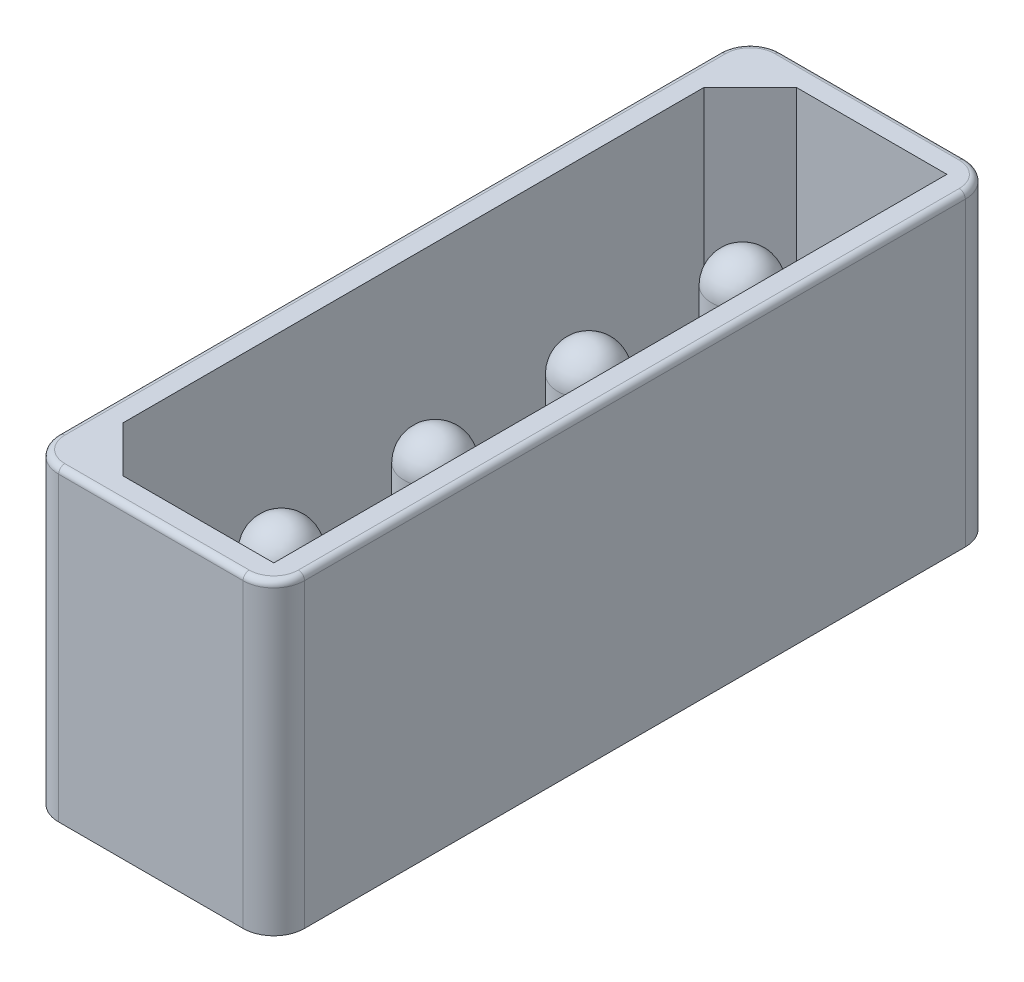
ISO-10303-21;
HEADER;
FILE_DESCRIPTION(('STEP AP214'),'2;1');
FILE_NAME('part.step','',(''),(''),'','','');
FILE_SCHEMA(('AUTOMOTIVE_DESIGN { 1 0 10303 214 1 1 1 1 }'));
ENDSEC;
DATA;
#1=APPLICATION_CONTEXT('core data for automotive mechanical design processes');
#2=APPLICATION_PROTOCOL_DEFINITION('international standard','automotive_design',2000,#1);
#3=PRODUCT_CONTEXT('',#1,'mechanical');
#4=PRODUCT('Part','Part','',(#3));
#5=PRODUCT_RELATED_PRODUCT_CATEGORY('part','',(#4));
#6=PRODUCT_DEFINITION_FORMATION('','',#4);
#7=PRODUCT_DEFINITION_CONTEXT('part definition',#1,'design');
#8=PRODUCT_DEFINITION('design','',#6,#7);
#9=PRODUCT_DEFINITION_SHAPE('','',#8);
#10=(LENGTH_UNIT() NAMED_UNIT(*) SI_UNIT(.MILLI.,.METRE.));
#11=(NAMED_UNIT(*) PLANE_ANGLE_UNIT() SI_UNIT($,.RADIAN.));
#12=(NAMED_UNIT(*) SI_UNIT($,.STERADIAN.) SOLID_ANGLE_UNIT());
#13=UNCERTAINTY_MEASURE_WITH_UNIT(LENGTH_MEASURE(1.E-05),#10,'distance_accuracy_value','');
#14=(GEOMETRIC_REPRESENTATION_CONTEXT(3) GLOBAL_UNCERTAINTY_ASSIGNED_CONTEXT((#13)) GLOBAL_UNIT_ASSIGNED_CONTEXT((#10,
#11,#12)) REPRESENTATION_CONTEXT('',''));
#15=CARTESIAN_POINT('',(0.,0.,0.));
#16=DIRECTION('',(0.,0.,1.));
#17=DIRECTION('',(1.,0.,0.));
#18=AXIS2_PLACEMENT_3D('',#15,#16,#17);
#19=CARTESIAN_POINT('',(-3.,1.5,10.75));
#20=DIRECTION('',(0.,-1.,0.));
#21=DIRECTION('',(0.,0.,-1.));
#22=AXIS2_PLACEMENT_3D('',#19,#20,#21);
#23=CYLINDRICAL_SURFACE('',#22,1.);
#24=CARTESIAN_POINT('',(-3.,1.,10.75));
#25=DIRECTION('',(0.,-1.,0.));
#26=DIRECTION('',(0.,0.,-1.));
#27=AXIS2_PLACEMENT_3D('',#24,#25,#26);
#28=CIRCLE('',#27,1.);
#29=CARTESIAN_POINT('',(-3.,1.,11.75));
#30=VERTEX_POINT('',#29);
#31=CARTESIAN_POINT('',(-4.,1.,10.75));
#32=VERTEX_POINT('',#31);
#33=EDGE_CURVE('E289',#30,#32,#28,.T.);
#34=ORIENTED_EDGE('',*,*,#33,.F.);
#35=DIRECTION('',(0.,-1.,0.));
#36=VECTOR('',#35,1.);
#37=CARTESIAN_POINT('',(-3.,1.5,11.75));
#38=LINE('',#37,#36);
#39=CARTESIAN_POINT('',(-3.,10.8,11.75));
#40=VERTEX_POINT('',#39);
#41=EDGE_CURVE('E12',#40,#30,#38,.T.);
#42=ORIENTED_EDGE('',*,*,#41,.F.);
#43=CARTESIAN_POINT('',(-3.,10.8,10.75));
#44=DIRECTION('',(0.,1.,0.));
#45=DIRECTION('',(0.,0.,1.));
#46=AXIS2_PLACEMENT_3D('',#43,#44,#45);
#47=CIRCLE('',#46,1.);
#48=CARTESIAN_POINT('',(-4.,10.8,10.75));
#49=VERTEX_POINT('',#48);
#50=EDGE_CURVE('E236',#40,#49,#47,.F.);
#51=ORIENTED_EDGE('',*,*,#50,.T.);
#52=DIRECTION('',(0.,-1.,0.));
#53=VECTOR('',#52,1.);
#54=CARTESIAN_POINT('',(-4.,1.5,10.75));
#55=LINE('',#54,#53);
#56=EDGE_CURVE('E51',#49,#32,#55,.T.);
#57=ORIENTED_EDGE('',*,*,#56,.T.);
#58=EDGE_LOOP('',(#34,#42,#51,#57));
#59=FACE_BOUND('',#58,.T.);
#60=ADVANCED_FACE('F48',(#59),#23,.T.);
#61=CARTESIAN_POINT('',(3.,1.5,11.75));
#62=DIRECTION('',(0.,0.,1.));
#63=DIRECTION('',(1.,0.,0.));
#64=AXIS2_PLACEMENT_3D('',#61,#62,#63);
#65=PLANE('',#64);
#66=DIRECTION('',(-1.,0.,0.));
#67=VECTOR('',#66,1.);
#68=CARTESIAN_POINT('',(3.,1.,11.75));
#69=LINE('',#68,#67);
#70=CARTESIAN_POINT('',(3.,1.,11.75));
#71=VERTEX_POINT('',#70);
#72=EDGE_CURVE('E310',#71,#30,#69,.T.);
#73=ORIENTED_EDGE('',*,*,#72,.F.);
#74=DIRECTION('',(0.,-1.,0.));
#75=VECTOR('',#74,1.);
#76=CARTESIAN_POINT('',(3.,1.5,11.75));
#77=LINE('',#76,#75);
#78=CARTESIAN_POINT('',(3.,10.8,11.75));
#79=VERTEX_POINT('',#78);
#80=EDGE_CURVE('E56',#79,#71,#77,.T.);
#81=ORIENTED_EDGE('',*,*,#80,.F.);
#82=DIRECTION('',(1.,0.,0.));
#83=VECTOR('',#82,1.);
#84=CARTESIAN_POINT('',(-3.,10.8,11.75));
#85=LINE('',#84,#83);
#86=EDGE_CURVE('E257',#79,#40,#85,.F.);
#87=ORIENTED_EDGE('',*,*,#86,.T.);
#88=ORIENTED_EDGE('',*,*,#41,.T.);
#89=EDGE_LOOP('',(#73,#81,#87,#88));
#90=FACE_BOUND('',#89,.T.);
#91=ADVANCED_FACE('F334',(#90),#65,.T.);
#92=CARTESIAN_POINT('',(3.,1.5,10.75));
#93=DIRECTION('',(0.,-1.,0.));
#94=DIRECTION('',(0.,0.,-1.));
#95=AXIS2_PLACEMENT_3D('',#92,#93,#94);
#96=CYLINDRICAL_SURFACE('',#95,1.);
#97=CARTESIAN_POINT('',(3.,1.,10.75));
#98=DIRECTION('',(0.,-1.,0.));
#99=DIRECTION('',(0.,0.,-1.));
#100=AXIS2_PLACEMENT_3D('',#97,#98,#99);
#101=CIRCLE('',#100,1.);
#102=CARTESIAN_POINT('',(4.,1.,10.75));
#103=VERTEX_POINT('',#102);
#104=EDGE_CURVE('E307',#103,#71,#101,.T.);
#105=ORIENTED_EDGE('',*,*,#104,.F.);
#106=DIRECTION('',(0.,-1.,0.));
#107=VECTOR('',#106,1.);
#108=CARTESIAN_POINT('',(4.,1.5,10.75));
#109=LINE('',#108,#107);
#110=CARTESIAN_POINT('',(4.,10.8,10.75));
#111=VERTEX_POINT('',#110);
#112=EDGE_CURVE('E314',#111,#103,#109,.T.);
#113=ORIENTED_EDGE('',*,*,#112,.F.);
#114=CARTESIAN_POINT('',(3.,10.8,10.75));
#115=DIRECTION('',(0.,1.,0.));
#116=DIRECTION('',(0.,0.,1.));
#117=AXIS2_PLACEMENT_3D('',#114,#115,#116);
#118=CIRCLE('',#117,1.);
#119=EDGE_CURVE('E254',#111,#79,#118,.F.);
#120=ORIENTED_EDGE('',*,*,#119,.T.);
#121=ORIENTED_EDGE('',*,*,#80,.T.);
#122=EDGE_LOOP('',(#105,#113,#120,#121));
#123=FACE_BOUND('',#122,.T.);
#124=ADVANCED_FACE('F381',(#123),#96,.T.);
#125=CARTESIAN_POINT('',(3.99999999999999,1.5,-10.75));
#126=DIRECTION('',(1.,0.,0.));
#127=DIRECTION('',(0.,0.,-1.));
#128=AXIS2_PLACEMENT_3D('',#125,#126,#127);
#129=PLANE('',#128);
#130=DIRECTION('',(0.,0.,1.));
#131=VECTOR('',#130,1.);
#132=CARTESIAN_POINT('',(3.99999999999999,1.,-10.75));
#133=LINE('',#132,#131);
#134=CARTESIAN_POINT('',(3.99999999999999,1.,-10.75));
#135=VERTEX_POINT('',#134);
#136=EDGE_CURVE('E304',#135,#103,#133,.T.);
#137=ORIENTED_EDGE('',*,*,#136,.F.);
#138=DIRECTION('',(0.,-1.,0.));
#139=VECTOR('',#138,1.);
#140=CARTESIAN_POINT('',(3.99999999999999,1.5,-10.75));
#141=LINE('',#140,#139);
#142=CARTESIAN_POINT('',(3.99999999999999,10.8,-10.75));
#143=VERTEX_POINT('',#142);
#144=EDGE_CURVE('E316',#143,#135,#141,.T.);
#145=ORIENTED_EDGE('',*,*,#144,.F.);
#146=DIRECTION('',(0.,0.,-1.));
#147=VECTOR('',#146,1.);
#148=CARTESIAN_POINT('',(4.,10.8,10.75));
#149=LINE('',#148,#147);
#150=EDGE_CURVE('E251',#143,#111,#149,.F.);
#151=ORIENTED_EDGE('',*,*,#150,.T.);
#152=ORIENTED_EDGE('',*,*,#112,.T.);
#153=EDGE_LOOP('',(#137,#145,#151,#152));
#154=FACE_BOUND('',#153,.T.);
#155=ADVANCED_FACE('F378',(#154),#129,.T.);
#156=CARTESIAN_POINT('',(2.99999999999999,1.5,-10.75));
#157=DIRECTION('',(0.,-1.,0.));
#158=DIRECTION('',(0.,0.,-1.));
#159=AXIS2_PLACEMENT_3D('',#156,#157,#158);
#160=CYLINDRICAL_SURFACE('',#159,1.);
#161=CARTESIAN_POINT('',(2.99999999999999,1.,-10.75));
#162=DIRECTION('',(0.,-1.,0.));
#163=DIRECTION('',(0.,0.,-1.));
#164=AXIS2_PLACEMENT_3D('',#161,#162,#163);
#165=CIRCLE('',#164,1.);
#166=CARTESIAN_POINT('',(2.99999999999999,1.,-11.75));
#167=VERTEX_POINT('',#166);
#168=EDGE_CURVE('E301',#167,#135,#165,.T.);
#169=ORIENTED_EDGE('',*,*,#168,.F.);
#170=DIRECTION('',(0.,-1.,0.));
#171=VECTOR('',#170,1.);
#172=CARTESIAN_POINT('',(2.99999999999999,1.5,-11.75));
#173=LINE('',#172,#171);
#174=CARTESIAN_POINT('',(2.99999999999999,10.8,-11.75));
#175=VERTEX_POINT('',#174);
#176=EDGE_CURVE('E318',#175,#167,#173,.T.);
#177=ORIENTED_EDGE('',*,*,#176,.F.);
#178=CARTESIAN_POINT('',(2.99999999999999,10.8,-10.75));
#179=DIRECTION('',(0.,1.,0.));
#180=DIRECTION('',(0.,0.,1.));
#181=AXIS2_PLACEMENT_3D('',#178,#179,#180);
#182=CIRCLE('',#181,1.);
#183=EDGE_CURVE('E248',#175,#143,#182,.F.);
#184=ORIENTED_EDGE('',*,*,#183,.T.);
#185=ORIENTED_EDGE('',*,*,#144,.T.);
#186=EDGE_LOOP('',(#169,#177,#184,#185));
#187=FACE_BOUND('',#186,.T.);
#188=ADVANCED_FACE('F375',(#187),#160,.T.);
#189=CARTESIAN_POINT('',(-3.,1.5,-11.75));
#190=DIRECTION('',(0.,0.,-1.));
#191=DIRECTION('',(-1.,0.,0.));
#192=AXIS2_PLACEMENT_3D('',#189,#190,#191);
#193=PLANE('',#192);
#194=DIRECTION('',(1.,0.,0.));
#195=VECTOR('',#194,1.);
#196=CARTESIAN_POINT('',(-3.,1.,-11.75));
#197=LINE('',#196,#195);
#198=CARTESIAN_POINT('',(-3.,1.,-11.75));
#199=VERTEX_POINT('',#198);
#200=EDGE_CURVE('E298',#199,#167,#197,.T.);
#201=ORIENTED_EDGE('',*,*,#200,.F.);
#202=DIRECTION('',(0.,-1.,0.));
#203=VECTOR('',#202,1.);
#204=CARTESIAN_POINT('',(-3.,1.5,-11.75));
#205=LINE('',#204,#203);
#206=CARTESIAN_POINT('',(-3.,10.8,-11.75));
#207=VERTEX_POINT('',#206);
#208=EDGE_CURVE('E320',#207,#199,#205,.T.);
#209=ORIENTED_EDGE('',*,*,#208,.F.);
#210=DIRECTION('',(-1.,0.,0.));
#211=VECTOR('',#210,1.);
#212=CARTESIAN_POINT('',(2.99999999999999,10.8,-11.75));
#213=LINE('',#212,#211);
#214=EDGE_CURVE('E245',#207,#175,#213,.F.);
#215=ORIENTED_EDGE('',*,*,#214,.T.);
#216=ORIENTED_EDGE('',*,*,#176,.T.);
#217=EDGE_LOOP('',(#201,#209,#215,#216));
#218=FACE_BOUND('',#217,.T.);
#219=ADVANCED_FACE('F367',(#218),#193,.T.);
#220=CARTESIAN_POINT('',(-3.,1.5,-10.75));
#221=DIRECTION('',(0.,-1.,0.));
#222=DIRECTION('',(0.,0.,-1.));
#223=AXIS2_PLACEMENT_3D('',#220,#221,#222);
#224=CYLINDRICAL_SURFACE('',#223,1.);
#225=CARTESIAN_POINT('',(-3.,1.,-10.75));
#226=DIRECTION('',(0.,-1.,0.));
#227=DIRECTION('',(0.,0.,-1.));
#228=AXIS2_PLACEMENT_3D('',#225,#226,#227);
#229=CIRCLE('',#228,1.);
#230=CARTESIAN_POINT('',(-4.,1.,-10.75));
#231=VERTEX_POINT('',#230);
#232=EDGE_CURVE('E295',#231,#199,#229,.T.);
#233=ORIENTED_EDGE('',*,*,#232,.F.);
#234=DIRECTION('',(0.,-1.,0.));
#235=VECTOR('',#234,1.);
#236=CARTESIAN_POINT('',(-4.,1.5,-10.75));
#237=LINE('',#236,#235);
#238=CARTESIAN_POINT('',(-4.,10.8,-10.75));
#239=VERTEX_POINT('',#238);
#240=EDGE_CURVE('E321',#239,#231,#237,.T.);
#241=ORIENTED_EDGE('',*,*,#240,.F.);
#242=CARTESIAN_POINT('',(-3.,10.8,-10.75));
#243=DIRECTION('',(0.,1.,0.));
#244=DIRECTION('',(0.,0.,1.));
#245=AXIS2_PLACEMENT_3D('',#242,#243,#244);
#246=CIRCLE('',#245,1.);
#247=EDGE_CURVE('E242',#239,#207,#246,.F.);
#248=ORIENTED_EDGE('',*,*,#247,.T.);
#249=ORIENTED_EDGE('',*,*,#208,.T.);
#250=EDGE_LOOP('',(#233,#241,#248,#249));
#251=FACE_BOUND('',#250,.T.);
#252=ADVANCED_FACE('F359',(#251),#224,.T.);
#253=CARTESIAN_POINT('',(-4.,1.5,10.75));
#254=DIRECTION('',(-1.,0.,0.));
#255=DIRECTION('',(0.,0.,1.));
#256=AXIS2_PLACEMENT_3D('',#253,#254,#255);
#257=PLANE('',#256);
#258=DIRECTION('',(0.,0.,-1.));
#259=VECTOR('',#258,1.);
#260=CARTESIAN_POINT('',(-4.,1.,10.75));
#261=LINE('',#260,#259);
#262=EDGE_CURVE('E292',#32,#231,#261,.T.);
#263=ORIENTED_EDGE('',*,*,#262,.F.);
#264=ORIENTED_EDGE('',*,*,#56,.F.);
#265=DIRECTION('',(0.,0.,1.));
#266=VECTOR('',#265,1.);
#267=CARTESIAN_POINT('',(-4.,10.8,-10.75));
#268=LINE('',#267,#266);
#269=EDGE_CURVE('E239',#49,#239,#268,.F.);
#270=ORIENTED_EDGE('',*,*,#269,.T.);
#271=ORIENTED_EDGE('',*,*,#240,.T.);
#272=EDGE_LOOP('',(#263,#264,#270,#271));
#273=FACE_BOUND('',#272,.T.);
#274=ADVANCED_FACE('F328',(#273),#257,.T.);
#275=CARTESIAN_POINT('',(-3.,1.,10.75));
#276=DIRECTION('',(0.,-1.,0.));
#277=DIRECTION('',(0.,0.,-1.));
#278=AXIS2_PLACEMENT_3D('',#275,#276,#277);
#279=PLANE('',#278);
#280=ORIENTED_EDGE('',*,*,#33,.T.);
#281=ORIENTED_EDGE('',*,*,#262,.T.);
#282=ORIENTED_EDGE('',*,*,#232,.T.);
#283=ORIENTED_EDGE('',*,*,#200,.T.);
#284=ORIENTED_EDGE('',*,*,#168,.T.);
#285=ORIENTED_EDGE('',*,*,#136,.T.);
#286=ORIENTED_EDGE('',*,*,#104,.T.);
#287=ORIENTED_EDGE('',*,*,#72,.T.);
#288=EDGE_LOOP('',(#280,#281,#282,#283,#284,#285,#286,#287));
#289=FACE_BOUND('',#288,.T.);
#290=ADVANCED_FACE('F330',(#289),#279,.T.);
#291=CARTESIAN_POINT('',(-3.2,11.,-10.95));
#292=DIRECTION('',(0.,0.,1.));
#293=DIRECTION('',(1.,0.,0.));
#294=AXIS2_PLACEMENT_3D('',#291,#292,#293);
#295=PLANE('',#294);
#296=DIRECTION('',(-1.,0.,0.));
#297=VECTOR('',#296,1.);
#298=CARTESIAN_POINT('',(-3.,1.5,-10.95));
#299=LINE('',#298,#297);
#300=CARTESIAN_POINT('',(3.2,1.5,-10.95));
#301=VERTEX_POINT('',#300);
#302=CARTESIAN_POINT('',(-1.69999999999999,1.5,-10.95));
#303=VERTEX_POINT('',#302);
#304=EDGE_CURVE('E190',#301,#303,#299,.T.);
#305=ORIENTED_EDGE('',*,*,#304,.F.);
#306=DIRECTION('',(0.,-1.,0.));
#307=VECTOR('',#306,1.);
#308=CARTESIAN_POINT('',(3.19999999999999,11.,-10.95));
#309=LINE('',#308,#307);
#310=CARTESIAN_POINT('',(3.19999999999999,11.,-10.95));
#311=VERTEX_POINT('',#310);
#312=EDGE_CURVE('E175',#311,#301,#309,.T.);
#313=ORIENTED_EDGE('',*,*,#312,.F.);
#314=DIRECTION('',(-1.,0.,0.));
#315=VECTOR('',#314,1.);
#316=CARTESIAN_POINT('',(-3.2,11.,-10.95));
#317=LINE('',#316,#315);
#318=CARTESIAN_POINT('',(-1.69999999999999,11.,-10.95));
#319=VERTEX_POINT('',#318);
#320=EDGE_CURVE('E188',#311,#319,#317,.T.);
#321=ORIENTED_EDGE('',*,*,#320,.T.);
#322=DIRECTION('',(0.,-1.,0.));
#323=VECTOR('',#322,1.);
#324=CARTESIAN_POINT('',(-1.69999999999999,0.,-10.95));
#325=LINE('',#324,#323);
#326=EDGE_CURVE('E214',#319,#303,#325,.T.);
#327=ORIENTED_EDGE('',*,*,#326,.T.);
#328=EDGE_LOOP('',(#305,#313,#321,#327));
#329=FACE_BOUND('',#328,.T.);
#330=ADVANCED_FACE('F186',(#329),#295,.T.);
#331=CARTESIAN_POINT('',(-3.2,11.,-10.95));
#332=DIRECTION('',(1.,0.,0.));
#333=DIRECTION('',(0.,0.,-1.));
#334=AXIS2_PLACEMENT_3D('',#331,#332,#333);
#335=PLANE('',#334);
#336=DIRECTION('',(0.,0.,1.));
#337=VECTOR('',#336,1.);
#338=CARTESIAN_POINT('',(-3.2,1.5,10.75));
#339=LINE('',#338,#337);
#340=CARTESIAN_POINT('',(-3.2,1.5,-9.45));
#341=VERTEX_POINT('',#340);
#342=CARTESIAN_POINT('',(-3.2,1.5,9.44999999999999));
#343=VERTEX_POINT('',#342);
#344=EDGE_CURVE('E286',#341,#343,#339,.T.);
#345=ORIENTED_EDGE('',*,*,#344,.F.);
#346=DIRECTION('',(0.,1.,0.));
#347=VECTOR('',#346,1.);
#348=CARTESIAN_POINT('',(-3.2,11.,-9.45));
#349=LINE('',#348,#347);
#350=CARTESIAN_POINT('',(-3.2,11.,-9.45));
#351=VERTEX_POINT('',#350);
#352=EDGE_CURVE('E207',#341,#351,#349,.T.);
#353=ORIENTED_EDGE('',*,*,#352,.T.);
#354=DIRECTION('',(0.,0.,1.));
#355=VECTOR('',#354,1.);
#356=CARTESIAN_POINT('',(-3.2,11.,-10.95));
#357=LINE('',#356,#355);
#358=CARTESIAN_POINT('',(-3.2,11.,9.44999999999999));
#359=VERTEX_POINT('',#358);
#360=EDGE_CURVE('E196',#351,#359,#357,.T.);
#361=ORIENTED_EDGE('',*,*,#360,.T.);
#362=DIRECTION('',(0.,-1.,0.));
#363=VECTOR('',#362,1.);
#364=CARTESIAN_POINT('',(-3.2,0.,9.44999999999999));
#365=LINE('',#364,#363);
#366=EDGE_CURVE('E209',#359,#343,#365,.T.);
#367=ORIENTED_EDGE('',*,*,#366,.T.);
#368=EDGE_LOOP('',(#345,#353,#361,#367));
#369=FACE_BOUND('',#368,.T.);
#370=ADVANCED_FACE('F422',(#369),#335,.T.);
#371=CARTESIAN_POINT('',(-3.2,11.,10.95));
#372=DIRECTION('',(0.,0.,-1.));
#373=DIRECTION('',(-1.,0.,0.));
#374=AXIS2_PLACEMENT_3D('',#371,#372,#373);
#375=PLANE('',#374);
#376=DIRECTION('',(1.,0.,0.));
#377=VECTOR('',#376,1.);
#378=CARTESIAN_POINT('',(-3.,1.5,10.95));
#379=LINE('',#378,#377);
#380=CARTESIAN_POINT('',(-1.70000000000001,1.5,10.95));
#381=VERTEX_POINT('',#380);
#382=CARTESIAN_POINT('',(3.2,1.5,10.95));
#383=VERTEX_POINT('',#382);
#384=EDGE_CURVE('E64',#381,#383,#379,.T.);
#385=ORIENTED_EDGE('',*,*,#384,.F.);
#386=DIRECTION('',(0.,1.,0.));
#387=VECTOR('',#386,1.);
#388=CARTESIAN_POINT('',(-1.70000000000001,11.,10.95));
#389=LINE('',#388,#387);
#390=CARTESIAN_POINT('',(-1.70000000000001,11.,10.95));
#391=VERTEX_POINT('',#390);
#392=EDGE_CURVE('E212',#381,#391,#389,.T.);
#393=ORIENTED_EDGE('',*,*,#392,.T.);
#394=DIRECTION('',(1.,0.,0.));
#395=VECTOR('',#394,1.);
#396=CARTESIAN_POINT('',(-3.2,11.,10.95));
#397=LINE('',#396,#395);
#398=CARTESIAN_POINT('',(3.2,11.,10.95));
#399=VERTEX_POINT('',#398);
#400=EDGE_CURVE('E181',#391,#399,#397,.T.);
#401=ORIENTED_EDGE('',*,*,#400,.T.);
#402=DIRECTION('',(0.,-1.,0.));
#403=VECTOR('',#402,1.);
#404=CARTESIAN_POINT('',(3.2,11.,10.95));
#405=LINE('',#404,#403);
#406=EDGE_CURVE('E177',#399,#383,#405,.T.);
#407=ORIENTED_EDGE('',*,*,#406,.T.);
#408=EDGE_LOOP('',(#385,#393,#401,#407));
#409=FACE_BOUND('',#408,.T.);
#410=ADVANCED_FACE('F427',(#409),#375,.T.);
#411=CARTESIAN_POINT('',(3.19999999999999,11.,-10.95));
#412=DIRECTION('',(-1.,0.,0.));
#413=DIRECTION('',(0.,0.,1.));
#414=AXIS2_PLACEMENT_3D('',#411,#412,#413);
#415=PLANE('',#414);
#416=DIRECTION('',(0.,0.,-1.));
#417=VECTOR('',#416,1.);
#418=CARTESIAN_POINT('',(3.2,1.5,10.75));
#419=LINE('',#418,#417);
#420=EDGE_CURVE('E283',#383,#301,#419,.T.);
#421=ORIENTED_EDGE('',*,*,#420,.F.);
#422=ORIENTED_EDGE('',*,*,#406,.F.);
#423=DIRECTION('',(0.,0.,-1.));
#424=VECTOR('',#423,1.);
#425=CARTESIAN_POINT('',(3.19999999999999,11.,-10.95));
#426=LINE('',#425,#424);
#427=EDGE_CURVE('E172',#399,#311,#426,.T.);
#428=ORIENTED_EDGE('',*,*,#427,.T.);
#429=ORIENTED_EDGE('',*,*,#312,.T.);
#430=EDGE_LOOP('',(#421,#422,#428,#429));
#431=FACE_BOUND('',#430,.T.);
#432=ADVANCED_FACE('F174',(#431),#415,.T.);
#433=CARTESIAN_POINT('',(-3.2,11.,9.44999999999999));
#434=DIRECTION('',(0.707106781186551,0.,-0.707106781186544));
#435=DIRECTION('',(-0.707106781186544,0.,-0.707106781186551));
#436=AXIS2_PLACEMENT_3D('',#433,#434,#435);
#437=PLANE('',#436);
#438=ORIENTED_EDGE('',*,*,#392,.F.);
#439=DIRECTION('',(0.707106781186544,0.,0.707106781186551));
#440=VECTOR('',#439,1.);
#441=CARTESIAN_POINT('',(-2.45,1.5,10.2));
#442=LINE('',#441,#440);
#443=EDGE_CURVE('E69',#381,#343,#442,.F.);
#444=ORIENTED_EDGE('',*,*,#443,.T.);
#445=ORIENTED_EDGE('',*,*,#366,.F.);
#446=DIRECTION('',(0.707106781186544,0.,0.707106781186551));
#447=VECTOR('',#446,1.);
#448=CARTESIAN_POINT('',(-3.2,11.,9.44999999999999));
#449=LINE('',#448,#447);
#450=EDGE_CURVE('E216',#391,#359,#449,.F.);
#451=ORIENTED_EDGE('',*,*,#450,.F.);
#452=EDGE_LOOP('',(#438,#444,#445,#451));
#453=FACE_BOUND('',#452,.T.);
#454=ADVANCED_FACE('F435',(#453),#437,.T.);
#455=CARTESIAN_POINT('',(-1.69999999999999,11.,-10.95));
#456=DIRECTION('',(0.707106781186543,0.,0.707106781186552));
#457=DIRECTION('',(0.707106781186552,0.,-0.707106781186543));
#458=AXIS2_PLACEMENT_3D('',#455,#456,#457);
#459=PLANE('',#458);
#460=ORIENTED_EDGE('',*,*,#352,.F.);
#461=DIRECTION('',(-0.707106781186552,0.,0.707106781186543));
#462=VECTOR('',#461,1.);
#463=CARTESIAN_POINT('',(-13.2,1.5,0.54999999999988));
#464=LINE('',#463,#462);
#465=EDGE_CURVE('E260',#341,#303,#464,.F.);
#466=ORIENTED_EDGE('',*,*,#465,.T.);
#467=ORIENTED_EDGE('',*,*,#326,.F.);
#468=DIRECTION('',(-0.707106781186552,0.,0.707106781186543));
#469=VECTOR('',#468,1.);
#470=CARTESIAN_POINT('',(-1.69999999999999,11.,-10.95));
#471=LINE('',#470,#469);
#472=EDGE_CURVE('E195',#351,#319,#471,.F.);
#473=ORIENTED_EDGE('',*,*,#472,.F.);
#474=EDGE_LOOP('',(#460,#466,#467,#473));
#475=FACE_BOUND('',#474,.T.);
#476=ADVANCED_FACE('F434',(#475),#459,.T.);
#477=CARTESIAN_POINT('',(-4.,11.,11.75));
#478=DIRECTION('',(0.,1.,0.));
#479=DIRECTION('',(0.,0.,1.));
#480=AXIS2_PLACEMENT_3D('',#477,#478,#479);
#481=PLANE('',#480);
#482=DIRECTION('',(0.,0.,1.));
#483=VECTOR('',#482,1.);
#484=CARTESIAN_POINT('',(-3.8,11.,10.75));
#485=LINE('',#484,#483);
#486=CARTESIAN_POINT('',(-3.8,11.,-10.75));
#487=VERTEX_POINT('',#486);
#488=CARTESIAN_POINT('',(-3.8,11.,10.75));
#489=VERTEX_POINT('',#488);
#490=EDGE_CURVE('E231',#487,#489,#485,.T.);
#491=ORIENTED_EDGE('',*,*,#490,.T.);
#492=CARTESIAN_POINT('',(-3.,11.,10.75));
#493=DIRECTION('',(0.,1.,0.));
#494=DIRECTION('',(0.,0.,1.));
#495=AXIS2_PLACEMENT_3D('',#492,#493,#494);
#496=CIRCLE('',#495,0.8);
#497=CARTESIAN_POINT('',(-3.,11.,11.55));
#498=VERTEX_POINT('',#497);
#499=EDGE_CURVE('E233',#489,#498,#496,.T.);
#500=ORIENTED_EDGE('',*,*,#499,.T.);
#501=DIRECTION('',(1.,0.,0.));
#502=VECTOR('',#501,1.);
#503=CARTESIAN_POINT('',(3.,11.,11.55));
#504=LINE('',#503,#502);
#505=CARTESIAN_POINT('',(3.,11.,11.55));
#506=VERTEX_POINT('',#505);
#507=EDGE_CURVE('E219',#498,#506,#504,.T.);
#508=ORIENTED_EDGE('',*,*,#507,.T.);
#509=CARTESIAN_POINT('',(3.,11.,10.75));
#510=DIRECTION('',(0.,1.,0.));
#511=DIRECTION('',(0.,0.,1.));
#512=AXIS2_PLACEMENT_3D('',#509,#510,#511);
#513=CIRCLE('',#512,0.8);
#514=CARTESIAN_POINT('',(3.8,11.,10.75));
#515=VERTEX_POINT('',#514);
#516=EDGE_CURVE('E221',#506,#515,#513,.T.);
#517=ORIENTED_EDGE('',*,*,#516,.T.);
#518=DIRECTION('',(0.,0.,-1.));
#519=VECTOR('',#518,1.);
#520=CARTESIAN_POINT('',(3.79999999999999,11.,-10.75));
#521=LINE('',#520,#519);
#522=CARTESIAN_POINT('',(3.79999999999999,11.,-10.75));
#523=VERTEX_POINT('',#522);
#524=EDGE_CURVE('E223',#515,#523,#521,.T.);
#525=ORIENTED_EDGE('',*,*,#524,.T.);
#526=CARTESIAN_POINT('',(2.99999999999999,11.,-10.75));
#527=DIRECTION('',(0.,1.,0.));
#528=DIRECTION('',(0.,0.,1.));
#529=AXIS2_PLACEMENT_3D('',#526,#527,#528);
#530=CIRCLE('',#529,0.8);
#531=CARTESIAN_POINT('',(2.99999999999999,11.,-11.55));
#532=VERTEX_POINT('',#531);
#533=EDGE_CURVE('E225',#523,#532,#530,.T.);
#534=ORIENTED_EDGE('',*,*,#533,.T.);
#535=DIRECTION('',(-1.,0.,0.));
#536=VECTOR('',#535,1.);
#537=CARTESIAN_POINT('',(-3.,11.,-11.55));
#538=LINE('',#537,#536);
#539=CARTESIAN_POINT('',(-3.,11.,-11.55));
#540=VERTEX_POINT('',#539);
#541=EDGE_CURVE('E227',#532,#540,#538,.T.);
#542=ORIENTED_EDGE('',*,*,#541,.T.);
#543=CARTESIAN_POINT('',(-3.,11.,-10.75));
#544=DIRECTION('',(0.,1.,0.));
#545=DIRECTION('',(0.,0.,1.));
#546=AXIS2_PLACEMENT_3D('',#543,#544,#545);
#547=CIRCLE('',#546,0.8);
#548=EDGE_CURVE('E229',#540,#487,#547,.T.);
#549=ORIENTED_EDGE('',*,*,#548,.T.);
#550=EDGE_LOOP('',(#491,#500,#508,#517,#525,#534,#542,#549));
#551=FACE_BOUND('',#550,.T.);
#552=ORIENTED_EDGE('',*,*,#360,.F.);
#553=ORIENTED_EDGE('',*,*,#472,.T.);
#554=ORIENTED_EDGE('',*,*,#320,.F.);
#555=ORIENTED_EDGE('',*,*,#427,.F.);
#556=ORIENTED_EDGE('',*,*,#400,.F.);
#557=ORIENTED_EDGE('',*,*,#450,.T.);
#558=EDGE_LOOP('',(#552,#553,#554,#555,#556,#557));
#559=FACE_BOUND('',#558,.T.);
#560=ADVANCED_FACE('F193',(#551,#559),#481,.T.);
#561=CARTESIAN_POINT('',(2.99999999999999,10.8,-10.75));
#562=DIRECTION('',(0.,1.,0.));
#563=DIRECTION('',(0.,0.,1.));
#564=AXIS2_PLACEMENT_3D('',#561,#562,#563);
#565=TOROIDAL_SURFACE('',#564,0.8,0.2);
#566=CARTESIAN_POINT('',(3.79999999999999,10.8,-10.75));
#567=DIRECTION('',(0.,0.,1.));
#568=DIRECTION('',(1.,0.,0.));
#569=AXIS2_PLACEMENT_3D('',#566,#567,#568);
#570=CIRCLE('',#569,0.2);
#571=EDGE_CURVE('E202',#143,#523,#570,.T.);
#572=ORIENTED_EDGE('',*,*,#571,.F.);
#573=ORIENTED_EDGE('',*,*,#183,.F.);
#574=CARTESIAN_POINT('',(2.99999999999999,10.8,-11.55));
#575=DIRECTION('',(-1.,0.,0.));
#576=DIRECTION('',(0.,0.,1.));
#577=AXIS2_PLACEMENT_3D('',#574,#575,#576);
#578=CIRCLE('',#577,0.2);
#579=EDGE_CURVE('E197',#532,#175,#578,.T.);
#580=ORIENTED_EDGE('',*,*,#579,.F.);
#581=ORIENTED_EDGE('',*,*,#533,.F.);
#582=EDGE_LOOP('',(#572,#573,#580,#581));
#583=FACE_BOUND('',#582,.T.);
#584=ADVANCED_FACE('F371',(#583),#565,.T.);
#585=CARTESIAN_POINT('',(-4.,10.8,-11.55));
#586=DIRECTION('',(1.,0.,0.));
#587=DIRECTION('',(0.,0.,-1.));
#588=AXIS2_PLACEMENT_3D('',#585,#586,#587);
#589=CYLINDRICAL_SURFACE('',#588,0.2);
#590=ORIENTED_EDGE('',*,*,#579,.T.);
#591=ORIENTED_EDGE('',*,*,#214,.F.);
#592=CARTESIAN_POINT('',(-3.,10.8,-11.55));
#593=DIRECTION('',(-1.,0.,0.));
#594=DIRECTION('',(0.,0.,1.));
#595=AXIS2_PLACEMENT_3D('',#592,#593,#594);
#596=CIRCLE('',#595,0.2);
#597=EDGE_CURVE('E275',#540,#207,#596,.T.);
#598=ORIENTED_EDGE('',*,*,#597,.F.);
#599=ORIENTED_EDGE('',*,*,#541,.F.);
#600=EDGE_LOOP('',(#590,#591,#598,#599));
#601=FACE_BOUND('',#600,.T.);
#602=ADVANCED_FACE('F362',(#601),#589,.T.);
#603=CARTESIAN_POINT('',(3.8,10.8,11.75));
#604=DIRECTION('',(0.,0.,1.));
#605=DIRECTION('',(1.,0.,0.));
#606=AXIS2_PLACEMENT_3D('',#603,#604,#605);
#607=CYLINDRICAL_SURFACE('',#606,0.2);
#608=ORIENTED_EDGE('',*,*,#571,.T.);
#609=ORIENTED_EDGE('',*,*,#524,.F.);
#610=CARTESIAN_POINT('',(3.8,10.8,10.75));
#611=DIRECTION('',(0.,0.,1.));
#612=DIRECTION('',(1.,0.,0.));
#613=AXIS2_PLACEMENT_3D('',#610,#611,#612);
#614=CIRCLE('',#613,0.2);
#615=EDGE_CURVE('E272',#111,#515,#614,.T.);
#616=ORIENTED_EDGE('',*,*,#615,.F.);
#617=ORIENTED_EDGE('',*,*,#150,.F.);
#618=EDGE_LOOP('',(#608,#609,#616,#617));
#619=FACE_BOUND('',#618,.T.);
#620=ADVANCED_FACE('F387',(#619),#607,.T.);
#621=CARTESIAN_POINT('',(-3.,10.8,-10.75));
#622=DIRECTION('',(0.,1.,0.));
#623=DIRECTION('',(0.,0.,1.));
#624=AXIS2_PLACEMENT_3D('',#621,#622,#623);
#625=TOROIDAL_SURFACE('',#624,0.8,0.2);
#626=ORIENTED_EDGE('',*,*,#597,.T.);
#627=ORIENTED_EDGE('',*,*,#247,.F.);
#628=CARTESIAN_POINT('',(-3.8,10.8,-10.75));
#629=DIRECTION('',(0.,0.,1.));
#630=DIRECTION('',(1.,0.,0.));
#631=AXIS2_PLACEMENT_3D('',#628,#629,#630);
#632=CIRCLE('',#631,0.2);
#633=EDGE_CURVE('E269',#487,#239,#632,.T.);
#634=ORIENTED_EDGE('',*,*,#633,.F.);
#635=ORIENTED_EDGE('',*,*,#548,.F.);
#636=EDGE_LOOP('',(#626,#627,#634,#635));
#637=FACE_BOUND('',#636,.T.);
#638=ADVANCED_FACE('F355',(#637),#625,.T.);
#639=CARTESIAN_POINT('',(3.,10.8,10.75));
#640=DIRECTION('',(0.,1.,0.));
#641=DIRECTION('',(0.,0.,1.));
#642=AXIS2_PLACEMENT_3D('',#639,#640,#641);
#643=TOROIDAL_SURFACE('',#642,0.8,0.2);
#644=ORIENTED_EDGE('',*,*,#615,.T.);
#645=ORIENTED_EDGE('',*,*,#516,.F.);
#646=CARTESIAN_POINT('',(3.,10.8,11.55));
#647=DIRECTION('',(-1.,0.,0.));
#648=DIRECTION('',(0.,0.,1.));
#649=AXIS2_PLACEMENT_3D('',#646,#647,#648);
#650=CIRCLE('',#649,0.2);
#651=EDGE_CURVE('E266',#79,#506,#650,.T.);
#652=ORIENTED_EDGE('',*,*,#651,.F.);
#653=ORIENTED_EDGE('',*,*,#119,.F.);
#654=EDGE_LOOP('',(#644,#645,#652,#653));
#655=FACE_BOUND('',#654,.T.);
#656=ADVANCED_FACE('F384',(#655),#643,.T.);
#657=CARTESIAN_POINT('',(-3.8,10.8,11.75));
#658=DIRECTION('',(0.,0.,-1.));
#659=DIRECTION('',(-1.,0.,0.));
#660=AXIS2_PLACEMENT_3D('',#657,#658,#659);
#661=CYLINDRICAL_SURFACE('',#660,0.2);
#662=ORIENTED_EDGE('',*,*,#633,.T.);
#663=ORIENTED_EDGE('',*,*,#269,.F.);
#664=CARTESIAN_POINT('',(-3.8,10.8,10.75));
#665=DIRECTION('',(0.,0.,1.));
#666=DIRECTION('',(1.,0.,0.));
#667=AXIS2_PLACEMENT_3D('',#664,#665,#666);
#668=CIRCLE('',#667,0.2);
#669=EDGE_CURVE('E263',#489,#49,#668,.T.);
#670=ORIENTED_EDGE('',*,*,#669,.F.);
#671=ORIENTED_EDGE('',*,*,#490,.F.);
#672=EDGE_LOOP('',(#662,#663,#670,#671));
#673=FACE_BOUND('',#672,.T.);
#674=ADVANCED_FACE('F352',(#673),#661,.T.);
#675=CARTESIAN_POINT('',(-4.,10.8,11.55));
#676=DIRECTION('',(-1.,0.,0.));
#677=DIRECTION('',(0.,0.,1.));
#678=AXIS2_PLACEMENT_3D('',#675,#676,#677);
#679=CYLINDRICAL_SURFACE('',#678,0.2);
#680=ORIENTED_EDGE('',*,*,#651,.T.);
#681=ORIENTED_EDGE('',*,*,#507,.F.);
#682=CARTESIAN_POINT('',(-3.,10.8,11.55));
#683=DIRECTION('',(-1.,0.,0.));
#684=DIRECTION('',(0.,0.,1.));
#685=AXIS2_PLACEMENT_3D('',#682,#683,#684);
#686=CIRCLE('',#685,0.2);
#687=EDGE_CURVE('E261',#40,#498,#686,.T.);
#688=ORIENTED_EDGE('',*,*,#687,.F.);
#689=ORIENTED_EDGE('',*,*,#86,.F.);
#690=EDGE_LOOP('',(#680,#681,#688,#689));
#691=FACE_BOUND('',#690,.T.);
#692=ADVANCED_FACE('F344',(#691),#679,.T.);
#693=CARTESIAN_POINT('',(-3.,10.8,10.75));
#694=DIRECTION('',(0.,1.,0.));
#695=DIRECTION('',(0.,0.,1.));
#696=AXIS2_PLACEMENT_3D('',#693,#694,#695);
#697=TOROIDAL_SURFACE('',#696,0.8,0.2);
#698=ORIENTED_EDGE('',*,*,#669,.T.);
#699=ORIENTED_EDGE('',*,*,#50,.F.);
#700=ORIENTED_EDGE('',*,*,#687,.T.);
#701=ORIENTED_EDGE('',*,*,#499,.F.);
#702=EDGE_LOOP('',(#698,#699,#700,#701));
#703=FACE_BOUND('',#702,.T.);
#704=ADVANCED_FACE('F339',(#703),#697,.T.);
#705=CARTESIAN_POINT('',(-3.,1.5,10.75));
#706=DIRECTION('',(0.,-1.,0.));
#707=DIRECTION('',(0.,0.,-1.));
#708=AXIS2_PLACEMENT_3D('',#705,#706,#707);
#709=PLANE('',#708);
#710=ORIENTED_EDGE('',*,*,#443,.F.);
#711=ORIENTED_EDGE('',*,*,#384,.T.);
#712=ORIENTED_EDGE('',*,*,#420,.T.);
#713=ORIENTED_EDGE('',*,*,#304,.T.);
#714=ORIENTED_EDGE('',*,*,#465,.F.);
#715=ORIENTED_EDGE('',*,*,#344,.T.);
#716=EDGE_LOOP('',(#710,#711,#712,#713,#714,#715));
#717=FACE_BOUND('',#716,.T.);
#718=ADVANCED_FACE('F444',(#717),#709,.F.);
#719=CLOSED_SHELL('',(#60,#91,#124,#155,#188,#219,#252,#274,#290,#330,#370,#410,#432,#454,#476,
#560,#584,#602,#620,#638,#656,#674,#692,#704,#718));
#720=MANIFOLD_SOLID_BREP('B2',#719);
#721=CARTESIAN_POINT('',(-1.57116751249922E-13,9.,-7.5));
#722=DIRECTION('',(0.,-1.,0.));
#723=DIRECTION('',(0.,0.,-1.));
#724=AXIS2_PLACEMENT_3D('',#721,#722,#723);
#725=CYLINDRICAL_SURFACE('',#724,1.);
#726=CARTESIAN_POINT('',(-1.57116751249922E-13,8.,-7.5));
#727=DIRECTION('',(0.,-1.,0.));
#728=DIRECTION('',(0.,0.,-1.));
#729=AXIS2_PLACEMENT_3D('',#726,#727,#728);
#730=CIRCLE('',#729,1.);
#731=CARTESIAN_POINT('',(-1.57116751249922E-13,8.,-8.5));
#732=VERTEX_POINT('',#731);
#733=EDGE_CURVE('E47',#732,#732,#730,.T.);
#734=ORIENTED_EDGE('',*,*,#733,.T.);
#735=EDGE_LOOP('',(#734));
#736=FACE_BOUND('',#735,.T.);
#737=CARTESIAN_POINT('',(-1.57116751249922E-13,1.,-7.5));
#738=DIRECTION('',(0.,1.,0.));
#739=DIRECTION('',(0.,0.,1.));
#740=AXIS2_PLACEMENT_3D('',#737,#738,#739);
#741=CIRCLE('',#740,1.);
#742=CARTESIAN_POINT('',(-1.57116751249922E-13,1.,-6.5));
#743=VERTEX_POINT('',#742);
#744=EDGE_CURVE('E667',#743,#743,#741,.T.);
#745=ORIENTED_EDGE('',*,*,#744,.T.);
#746=EDGE_LOOP('',(#745));
#747=FACE_BOUND('',#746,.T.);
#748=ADVANCED_FACE('F660',(#736,#747),#725,.T.);
#749=CARTESIAN_POINT('',(-1.57116751249922E-13,1.,-7.5));
#750=DIRECTION('',(0.,1.,0.));
#751=DIRECTION('',(0.,0.,1.));
#752=AXIS2_PLACEMENT_3D('',#749,#750,#751);
#753=PLANE('',#752);
#754=ORIENTED_EDGE('',*,*,#744,.F.);
#755=EDGE_LOOP('',(#754));
#756=FACE_BOUND('',#755,.T.);
#757=ADVANCED_FACE('F674',(#756),#753,.F.);
#758=CARTESIAN_POINT('',(-1.57116751249922E-13,8.,-7.5));
#759=DIRECTION('',(0.,0.,1.));
#760=DIRECTION('',(1.,0.,0.));
#761=AXIS2_PLACEMENT_3D('',#758,#759,#760);
#762=SPHERICAL_SURFACE('',#761,1.);
#763=CARTESIAN_POINT('',(-1.57116751249922E-13,8.,-7.5));
#764=DIRECTION('',(0.,-1.,0.));
#765=DIRECTION('',(0.,0.,-1.));
#766=AXIS2_PLACEMENT_3D('',#763,#764,#765);
#767=SPHERICAL_SURFACE('',#766,1.);
#768=ORIENTED_EDGE('',*,*,#733,.F.);
#769=EDGE_LOOP('',(#768));
#770=FACE_BOUND('',#769,.T.);
#771=ADVANCED_FACE('F662',(#770),#767,.T.);
#772=CLOSED_SHELL('',(#748,#757,#771));
#773=MANIFOLD_SOLID_BREP('B6',#772);
#774=CARTESIAN_POINT('',(-1.04744500833281E-13,9.,-2.5));
#775=DIRECTION('',(0.,-1.,0.));
#776=DIRECTION('',(0.,0.,-1.));
#777=AXIS2_PLACEMENT_3D('',#774,#775,#776);
#778=CYLINDRICAL_SURFACE('',#777,1.);
#779=CARTESIAN_POINT('',(-1.04744500833281E-13,8.,-2.5));
#780=DIRECTION('',(0.,-1.,0.));
#781=DIRECTION('',(0.,0.,-1.));
#782=AXIS2_PLACEMENT_3D('',#779,#780,#781);
#783=CIRCLE('',#782,1.);
#784=CARTESIAN_POINT('',(-1.04744500833281E-13,8.,-3.5));
#785=VERTEX_POINT('',#784);
#786=EDGE_CURVE('E659',#785,#785,#783,.T.);
#787=ORIENTED_EDGE('',*,*,#786,.T.);
#788=EDGE_LOOP('',(#787));
#789=FACE_BOUND('',#788,.T.);
#790=CARTESIAN_POINT('',(-1.04744500833281E-13,1.,-2.5));
#791=DIRECTION('',(0.,1.,0.));
#792=DIRECTION('',(0.,0.,1.));
#793=AXIS2_PLACEMENT_3D('',#790,#791,#792);
#794=CIRCLE('',#793,1.);
#795=CARTESIAN_POINT('',(-1.04744500833281E-13,1.,-1.5));
#796=VERTEX_POINT('',#795);
#797=EDGE_CURVE('E716',#796,#796,#794,.T.);
#798=ORIENTED_EDGE('',*,*,#797,.T.);
#799=EDGE_LOOP('',(#798));
#800=FACE_BOUND('',#799,.T.);
#801=ADVANCED_FACE('F709',(#789,#800),#778,.T.);
#802=CARTESIAN_POINT('',(-1.04744500833281E-13,1.,-2.5));
#803=DIRECTION('',(0.,1.,0.));
#804=DIRECTION('',(0.,0.,1.));
#805=AXIS2_PLACEMENT_3D('',#802,#803,#804);
#806=PLANE('',#805);
#807=ORIENTED_EDGE('',*,*,#797,.F.);
#808=EDGE_LOOP('',(#807));
#809=FACE_BOUND('',#808,.T.);
#810=ADVANCED_FACE('F723',(#809),#806,.F.);
#811=CARTESIAN_POINT('',(-1.04744500833281E-13,8.,-2.5));
#812=DIRECTION('',(0.,0.,1.));
#813=DIRECTION('',(1.,0.,0.));
#814=AXIS2_PLACEMENT_3D('',#811,#812,#813);
#815=SPHERICAL_SURFACE('',#814,1.);
#816=CARTESIAN_POINT('',(-1.04744500833281E-13,8.,-2.5));
#817=DIRECTION('',(0.,-1.,0.));
#818=DIRECTION('',(0.,0.,-1.));
#819=AXIS2_PLACEMENT_3D('',#816,#817,#818);
#820=SPHERICAL_SURFACE('',#819,1.);
#821=ORIENTED_EDGE('',*,*,#786,.F.);
#822=EDGE_LOOP('',(#821));
#823=FACE_BOUND('',#822,.T.);
#824=ADVANCED_FACE('F711',(#823),#820,.T.);
#825=CLOSED_SHELL('',(#801,#810,#824));
#826=MANIFOLD_SOLID_BREP('B42',#825);
#827=CARTESIAN_POINT('',(0.,9.,2.5));
#828=DIRECTION('',(0.,-1.,0.));
#829=DIRECTION('',(0.,0.,-1.));
#830=AXIS2_PLACEMENT_3D('',#827,#828,#829);
#831=CYLINDRICAL_SURFACE('',#830,1.);
#832=CARTESIAN_POINT('',(0.,8.,2.5));
#833=DIRECTION('',(0.,-1.,0.));
#834=DIRECTION('',(0.,0.,-1.));
#835=AXIS2_PLACEMENT_3D('',#832,#833,#834);
#836=CIRCLE('',#835,1.);
#837=CARTESIAN_POINT('',(0.,8.,1.5));
#838=VERTEX_POINT('',#837);
#839=EDGE_CURVE('E708',#838,#838,#836,.T.);
#840=ORIENTED_EDGE('',*,*,#839,.T.);
#841=EDGE_LOOP('',(#840));
#842=FACE_BOUND('',#841,.T.);
#843=CARTESIAN_POINT('',(0.,1.,2.5));
#844=DIRECTION('',(0.,1.,0.));
#845=DIRECTION('',(0.,0.,1.));
#846=AXIS2_PLACEMENT_3D('',#843,#844,#845);
#847=CIRCLE('',#846,1.);
#848=CARTESIAN_POINT('',(0.,1.,3.5));
#849=VERTEX_POINT('',#848);
#850=EDGE_CURVE('E764',#849,#849,#847,.T.);
#851=ORIENTED_EDGE('',*,*,#850,.T.);
#852=EDGE_LOOP('',(#851));
#853=FACE_BOUND('',#852,.T.);
#854=ADVANCED_FACE('F757',(#842,#853),#831,.T.);
#855=CARTESIAN_POINT('',(0.,1.,2.5));
#856=DIRECTION('',(0.,1.,0.));
#857=DIRECTION('',(0.,0.,1.));
#858=AXIS2_PLACEMENT_3D('',#855,#856,#857);
#859=PLANE('',#858);
#860=ORIENTED_EDGE('',*,*,#850,.F.);
#861=EDGE_LOOP('',(#860));
#862=FACE_BOUND('',#861,.T.);
#863=ADVANCED_FACE('F771',(#862),#859,.F.);
#864=CARTESIAN_POINT('',(0.,8.,2.5));
#865=DIRECTION('',(0.,0.,1.));
#866=DIRECTION('',(1.,0.,0.));
#867=AXIS2_PLACEMENT_3D('',#864,#865,#866);
#868=SPHERICAL_SURFACE('',#867,1.);
#869=CARTESIAN_POINT('',(0.,8.,2.5));
#870=DIRECTION('',(0.,-1.,0.));
#871=DIRECTION('',(0.,0.,-1.));
#872=AXIS2_PLACEMENT_3D('',#869,#870,#871);
#873=SPHERICAL_SURFACE('',#872,1.);
#874=ORIENTED_EDGE('',*,*,#839,.F.);
#875=EDGE_LOOP('',(#874));
#876=FACE_BOUND('',#875,.T.);
#877=ADVANCED_FACE('F759',(#876),#873,.T.);
#878=CLOSED_SHELL('',(#854,#863,#877));
#879=MANIFOLD_SOLID_BREP('B654',#878);
#880=CARTESIAN_POINT('',(0.,9.,7.5));
#881=DIRECTION('',(0.,-1.,0.));
#882=DIRECTION('',(0.,0.,-1.));
#883=AXIS2_PLACEMENT_3D('',#880,#881,#882);
#884=CYLINDRICAL_SURFACE('',#883,1.);
#885=CARTESIAN_POINT('',(0.,8.,7.5));
#886=DIRECTION('',(0.,-1.,0.));
#887=DIRECTION('',(0.,0.,-1.));
#888=AXIS2_PLACEMENT_3D('',#885,#886,#887);
#889=CIRCLE('',#888,1.);
#890=CARTESIAN_POINT('',(0.,8.,6.5));
#891=VERTEX_POINT('',#890);
#892=EDGE_CURVE('E756',#891,#891,#889,.T.);
#893=ORIENTED_EDGE('',*,*,#892,.T.);
#894=EDGE_LOOP('',(#893));
#895=FACE_BOUND('',#894,.T.);
#896=CARTESIAN_POINT('',(0.,1.,7.5));
#897=DIRECTION('',(0.,1.,0.));
#898=DIRECTION('',(0.,0.,1.));
#899=AXIS2_PLACEMENT_3D('',#896,#897,#898);
#900=CIRCLE('',#899,1.);
#901=CARTESIAN_POINT('',(0.,1.,8.5));
#902=VERTEX_POINT('',#901);
#903=EDGE_CURVE('E805',#902,#902,#900,.T.);
#904=ORIENTED_EDGE('',*,*,#903,.T.);
#905=EDGE_LOOP('',(#904));
#906=FACE_BOUND('',#905,.T.);
#907=ADVANCED_FACE('F798',(#895,#906),#884,.T.);
#908=CARTESIAN_POINT('',(0.,1.,7.5));
#909=DIRECTION('',(0.,1.,0.));
#910=DIRECTION('',(0.,0.,1.));
#911=AXIS2_PLACEMENT_3D('',#908,#909,#910);
#912=PLANE('',#911);
#913=ORIENTED_EDGE('',*,*,#903,.F.);
#914=EDGE_LOOP('',(#913));
#915=FACE_BOUND('',#914,.T.);
#916=ADVANCED_FACE('F812',(#915),#912,.F.);
#917=CARTESIAN_POINT('',(0.,8.,7.5));
#918=DIRECTION('',(0.,0.,1.));
#919=DIRECTION('',(1.,0.,0.));
#920=AXIS2_PLACEMENT_3D('',#917,#918,#919);
#921=SPHERICAL_SURFACE('',#920,1.);
#922=CARTESIAN_POINT('',(0.,8.,7.5));
#923=DIRECTION('',(0.,-1.,0.));
#924=DIRECTION('',(0.,0.,-1.));
#925=AXIS2_PLACEMENT_3D('',#922,#923,#924);
#926=SPHERICAL_SURFACE('',#925,1.);
#927=ORIENTED_EDGE('',*,*,#892,.F.);
#928=EDGE_LOOP('',(#927));
#929=FACE_BOUND('',#928,.T.);
#930=ADVANCED_FACE('F800',(#929),#926,.T.);
#931=CLOSED_SHELL('',(#907,#916,#930));
#932=MANIFOLD_SOLID_BREP('B703',#931);
#933=ADVANCED_BREP_SHAPE_REPRESENTATION('',(#18,#720,#773,#826,#879,#932),#14);
#934=SHAPE_DEFINITION_REPRESENTATION(#9,#933);
ENDSEC;
END-ISO-10303-21;
